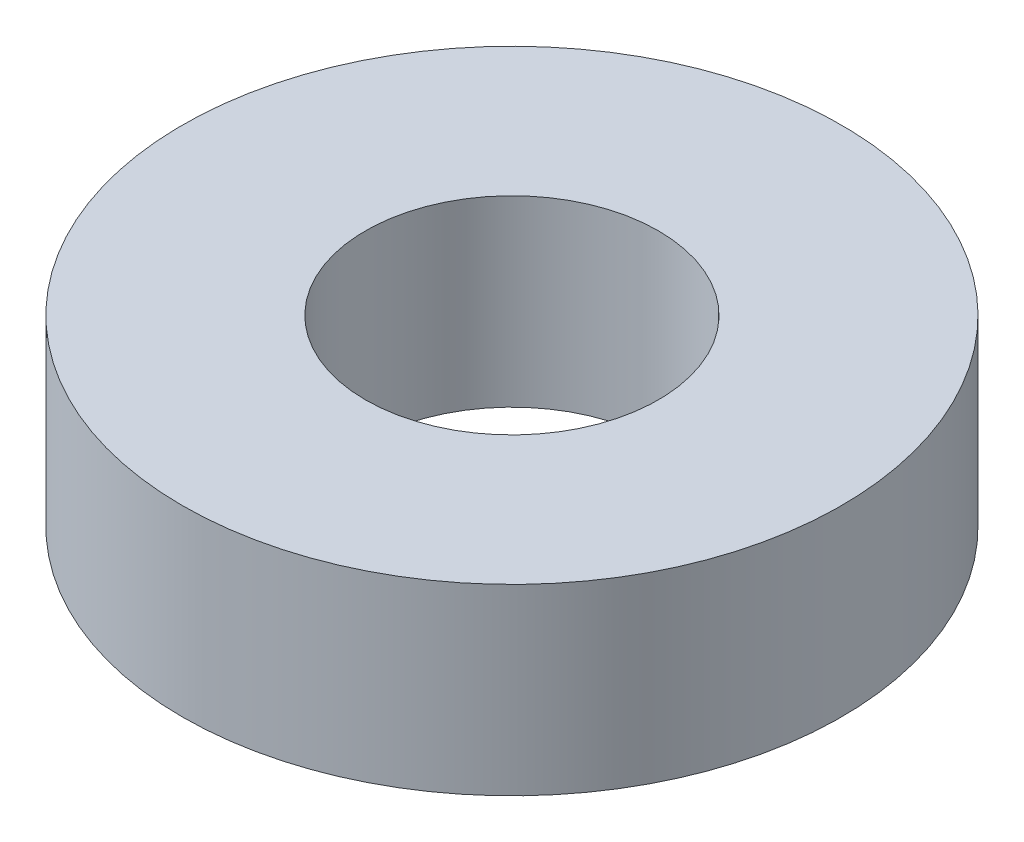
ISO-10303-21;
HEADER;
FILE_DESCRIPTION(('STEP AP214'),'2;1');
FILE_NAME('part.step','',(''),(''),'','','');
FILE_SCHEMA(('AUTOMOTIVE_DESIGN { 1 0 10303 214 1 1 1 1 }'));
ENDSEC;
DATA;
#1=APPLICATION_CONTEXT('core data for automotive mechanical design processes');
#2=APPLICATION_PROTOCOL_DEFINITION('international standard','automotive_design',2000,#1);
#3=PRODUCT_CONTEXT('',#1,'mechanical');
#4=PRODUCT('Part','Part','',(#3));
#5=PRODUCT_RELATED_PRODUCT_CATEGORY('part','',(#4));
#6=PRODUCT_DEFINITION_FORMATION('','',#4);
#7=PRODUCT_DEFINITION_CONTEXT('part definition',#1,'design');
#8=PRODUCT_DEFINITION('design','',#6,#7);
#9=PRODUCT_DEFINITION_SHAPE('','',#8);
#10=(LENGTH_UNIT() NAMED_UNIT(*) SI_UNIT(.MILLI.,.METRE.));
#11=(NAMED_UNIT(*) PLANE_ANGLE_UNIT() SI_UNIT($,.RADIAN.));
#12=(NAMED_UNIT(*) SI_UNIT($,.STERADIAN.) SOLID_ANGLE_UNIT());
#13=UNCERTAINTY_MEASURE_WITH_UNIT(LENGTH_MEASURE(1.E-05),#10,'distance_accuracy_value','');
#14=(GEOMETRIC_REPRESENTATION_CONTEXT(3) GLOBAL_UNCERTAINTY_ASSIGNED_CONTEXT((#13)) GLOBAL_UNIT_ASSIGNED_CONTEXT((#10,
#11,#12)) REPRESENTATION_CONTEXT('',''));
#15=CARTESIAN_POINT('',(0.,0.,0.));
#16=DIRECTION('',(0.,0.,1.));
#17=DIRECTION('',(1.,0.,0.));
#18=AXIS2_PLACEMENT_3D('',#15,#16,#17);
#19=CARTESIAN_POINT('',(0.,7.9375,0.));
#20=DIRECTION('',(0.,1.,0.));
#21=DIRECTION('',(0.,0.,1.));
#22=AXIS2_PLACEMENT_3D('',#19,#20,#21);
#23=PLANE('',#22);
#24=CARTESIAN_POINT('',(0.,7.9375,0.));
#25=DIRECTION('',(0.,1.,0.));
#26=DIRECTION('',(0.,0.,1.));
#27=AXIS2_PLACEMENT_3D('',#24,#25,#26);
#28=CIRCLE('',#27,14.2875);
#29=CARTESIAN_POINT('',(0.,7.9375,14.2875));
#30=VERTEX_POINT('',#29);
#31=EDGE_CURVE('E10',#30,#30,#28,.T.);
#32=ORIENTED_EDGE('',*,*,#31,.T.);
#33=EDGE_LOOP('',(#32));
#34=FACE_BOUND('',#33,.T.);
#35=CARTESIAN_POINT('',(0.,7.9375,0.));
#36=DIRECTION('',(0.,1.,0.));
#37=DIRECTION('',(0.,0.,1.));
#38=AXIS2_PLACEMENT_3D('',#35,#36,#37);
#39=CIRCLE('',#38,6.35);
#40=CARTESIAN_POINT('',(0.,7.9375,6.35));
#41=VERTEX_POINT('',#40);
#42=EDGE_CURVE('E42',#41,#41,#39,.T.);
#43=ORIENTED_EDGE('',*,*,#42,.F.);
#44=EDGE_LOOP('',(#43));
#45=FACE_BOUND('',#44,.T.);
#46=ADVANCED_FACE('F31',(#34,#45),#23,.T.);
#47=CARTESIAN_POINT('',(0.,0.,0.));
#48=DIRECTION('',(0.,1.,0.));
#49=DIRECTION('',(0.,0.,1.));
#50=AXIS2_PLACEMENT_3D('',#47,#48,#49);
#51=PLANE('',#50);
#52=CARTESIAN_POINT('',(0.,0.,0.));
#53=DIRECTION('',(0.,1.,0.));
#54=DIRECTION('',(0.,0.,1.));
#55=AXIS2_PLACEMENT_3D('',#52,#53,#54);
#56=CIRCLE('',#55,14.2875);
#57=CARTESIAN_POINT('',(0.,0.,14.2875));
#58=VERTEX_POINT('',#57);
#59=EDGE_CURVE('E35',#58,#58,#56,.T.);
#60=ORIENTED_EDGE('',*,*,#59,.F.);
#61=EDGE_LOOP('',(#60));
#62=FACE_BOUND('',#61,.T.);
#63=CARTESIAN_POINT('',(0.,0.,0.));
#64=DIRECTION('',(0.,1.,0.));
#65=DIRECTION('',(0.,0.,1.));
#66=AXIS2_PLACEMENT_3D('',#63,#64,#65);
#67=CIRCLE('',#66,6.35);
#68=CARTESIAN_POINT('',(0.,0.,6.35));
#69=VERTEX_POINT('',#68);
#70=EDGE_CURVE('E44',#69,#69,#67,.T.);
#71=ORIENTED_EDGE('',*,*,#70,.T.);
#72=EDGE_LOOP('',(#71));
#73=FACE_BOUND('',#72,.T.);
#74=ADVANCED_FACE('F54',(#62,#73),#51,.F.);
#75=CARTESIAN_POINT('',(0.,7.9375,0.));
#76=DIRECTION('',(0.,-1.,0.));
#77=DIRECTION('',(0.,0.,-1.));
#78=AXIS2_PLACEMENT_3D('',#75,#76,#77);
#79=CYLINDRICAL_SURFACE('',#78,14.2875);
#80=ORIENTED_EDGE('',*,*,#31,.F.);
#81=EDGE_LOOP('',(#80));
#82=FACE_BOUND('',#81,.T.);
#83=ORIENTED_EDGE('',*,*,#59,.T.);
#84=EDGE_LOOP('',(#83));
#85=FACE_BOUND('',#84,.T.);
#86=ADVANCED_FACE('F33',(#82,#85),#79,.T.);
#87=CARTESIAN_POINT('',(0.,7.9375,0.));
#88=DIRECTION('',(0.,-1.,0.));
#89=DIRECTION('',(0.,0.,-1.));
#90=AXIS2_PLACEMENT_3D('',#87,#88,#89);
#91=CYLINDRICAL_SURFACE('',#90,6.35);
#92=ORIENTED_EDGE('',*,*,#42,.T.);
#93=EDGE_LOOP('',(#92));
#94=FACE_BOUND('',#93,.T.);
#95=ORIENTED_EDGE('',*,*,#70,.F.);
#96=EDGE_LOOP('',(#95));
#97=FACE_BOUND('',#96,.T.);
#98=ADVANCED_FACE('F50',(#94,#97),#91,.F.);
#99=CLOSED_SHELL('',(#46,#74,#86,#98));
#100=MANIFOLD_SOLID_BREP('B2',#99);
#101=ADVANCED_BREP_SHAPE_REPRESENTATION('',(#18,#100),#14);
#102=SHAPE_DEFINITION_REPRESENTATION(#9,#101);
ENDSEC;
END-ISO-10303-21;
